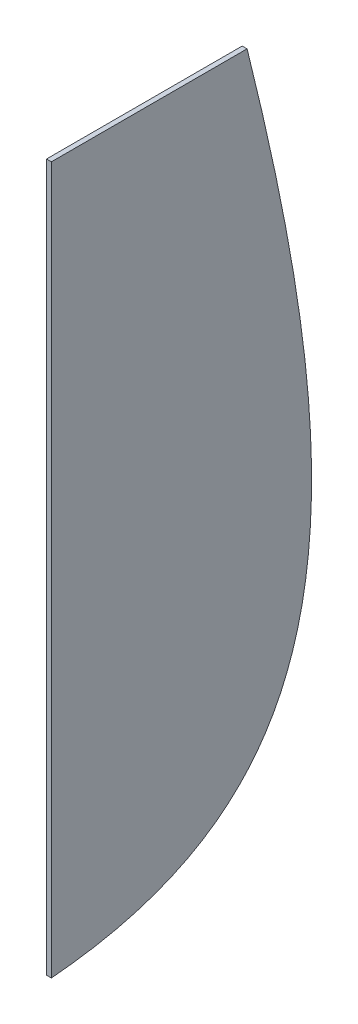
ISO-10303-21;
HEADER;
FILE_DESCRIPTION(('STEP AP214'),'2;1');
FILE_NAME('part.step','',(''),(''),'','','');
FILE_SCHEMA(('AUTOMOTIVE_DESIGN { 1 0 10303 214 1 1 1 1 }'));
ENDSEC;
DATA;
#1=APPLICATION_CONTEXT('core data for automotive mechanical design processes');
#2=APPLICATION_PROTOCOL_DEFINITION('international standard','automotive_design',2000,#1);
#3=PRODUCT_CONTEXT('',#1,'mechanical');
#4=PRODUCT('Part','Part','',(#3));
#5=PRODUCT_RELATED_PRODUCT_CATEGORY('part','',(#4));
#6=PRODUCT_DEFINITION_FORMATION('','',#4);
#7=PRODUCT_DEFINITION_CONTEXT('part definition',#1,'design');
#8=PRODUCT_DEFINITION('design','',#6,#7);
#9=PRODUCT_DEFINITION_SHAPE('','',#8);
#10=(LENGTH_UNIT() NAMED_UNIT(*) SI_UNIT(.MILLI.,.METRE.));
#11=(NAMED_UNIT(*) PLANE_ANGLE_UNIT() SI_UNIT($,.RADIAN.));
#12=(NAMED_UNIT(*) SI_UNIT($,.STERADIAN.) SOLID_ANGLE_UNIT());
#13=UNCERTAINTY_MEASURE_WITH_UNIT(LENGTH_MEASURE(1.E-05),#10,'distance_accuracy_value','');
#14=(GEOMETRIC_REPRESENTATION_CONTEXT(3) GLOBAL_UNCERTAINTY_ASSIGNED_CONTEXT((#13)) GLOBAL_UNIT_ASSIGNED_CONTEXT((#10,
#11,#12)) REPRESENTATION_CONTEXT('',''));
#15=CARTESIAN_POINT('',(0.,0.,0.));
#16=DIRECTION('',(0.,0.,1.));
#17=DIRECTION('',(1.,0.,0.));
#18=AXIS2_PLACEMENT_3D('',#15,#16,#17);
#19=CARTESIAN_POINT('',(-0.50000000000014,-1.5206108960727E-13,-40.1439662287613));
#20=DIRECTION('',(0.,-1.,0.));
#21=DIRECTION('',(0.,0.,1.));
#22=AXIS2_PLACEMENT_3D('',#19,#20,#21);
#23=PLANE('',#22);
#24=DIRECTION('',(0.,0.,-1.));
#25=VECTOR('',#24,1.);
#26=CARTESIAN_POINT('',(0.49999999999986,-1.38095164251897E-13,-40.1439662287613));
#27=LINE('',#26,#25);
#28=CARTESIAN_POINT('',(0.5,0.,0.));
#29=VERTEX_POINT('',#28);
#30=CARTESIAN_POINT('',(0.49999999999986,-1.38095164251897E-13,-40.1439662287613));
#31=VERTEX_POINT('',#30);
#32=EDGE_CURVE('E66',#29,#31,#27,.T.);
#33=ORIENTED_EDGE('',*,*,#32,.T.);
#34=DIRECTION('',(1.,0.,0.));
#35=VECTOR('',#34,1.);
#36=CARTESIAN_POINT('',(-0.50000000000014,-1.5206108960727E-13,-40.1439662287613));
#37=LINE('',#36,#35);
#38=CARTESIAN_POINT('',(-0.50000000000014,-1.5206108960727E-13,-40.1439662287613));
#39=VERTEX_POINT('',#38);
#40=EDGE_CURVE('E44',#39,#31,#37,.T.);
#41=ORIENTED_EDGE('',*,*,#40,.F.);
#42=DIRECTION('',(0.,0.,-1.));
#43=VECTOR('',#42,1.);
#44=CARTESIAN_POINT('',(-0.50000000000014,-1.5206108960727E-13,-40.1439662287613));
#45=LINE('',#44,#43);
#46=CARTESIAN_POINT('',(-0.5,0.,0.));
#47=VERTEX_POINT('',#46);
#48=EDGE_CURVE('E74',#47,#39,#45,.T.);
#49=ORIENTED_EDGE('',*,*,#48,.F.);
#50=DIRECTION('',(1.,0.,0.));
#51=VECTOR('',#50,1.);
#52=CARTESIAN_POINT('',(-0.5,0.,0.));
#53=LINE('',#52,#51);
#54=EDGE_CURVE('E11',#47,#29,#53,.T.);
#55=ORIENTED_EDGE('',*,*,#54,.T.);
#56=EDGE_LOOP('',(#33,#41,#49,#55));
#57=FACE_BOUND('',#56,.T.);
#58=ADVANCED_FACE('F36',(#57),#23,.F.);
#59=CARTESIAN_POINT('',(-0.50000000000014,-1.5206108960727E-13,-40.1439662287613));
#60=CARTESIAN_POINT('',(-0.499999999998881,-96.1055639621332,-64.0701194417086));
#61=CARTESIAN_POINT('',(-0.499999999998248,-140.053769681774,-58.2824836294395));
#62=CARTESIAN_POINT('',(-0.499999999997975,-145.,5.08010534801672E-13));
#63=B_SPLINE_CURVE_WITH_KNOTS('',3,(#59,#60,#61,#62),.UNSPECIFIED.,.F.,.F.,(4,4),(0.,1.),.UNSPECIFIED.);
#64=DIRECTION('',(1.,0.,0.));
#65=VECTOR('',#64,1.);
#66=SURFACE_OF_LINEAR_EXTRUSION('',#63,#65);
#67=CARTESIAN_POINT('',(0.49999999999986,-1.38095164251897E-13,-40.1439662287613));
#68=CARTESIAN_POINT('',(0.500000000001119,-96.1055639621332,-64.0701194417086));
#69=CARTESIAN_POINT('',(0.500000000001752,-140.053769681774,-58.2824836294395));
#70=CARTESIAN_POINT('',(0.500000000002025,-145.,5.04519053462829E-13));
#71=B_SPLINE_CURVE_WITH_KNOTS('',3,(#67,#68,#69,#70),.UNSPECIFIED.,.F.,.F.,(4,4),(0.,1.),.UNSPECIFIED.);
#72=CARTESIAN_POINT('',(0.500000000002025,-145.,5.04519053462829E-13));
#73=VERTEX_POINT('',#72);
#74=EDGE_CURVE('E72',#31,#73,#71,.T.);
#75=ORIENTED_EDGE('',*,*,#74,.T.);
#76=DIRECTION('',(1.,0.,0.));
#77=VECTOR('',#76,1.);
#78=CARTESIAN_POINT('',(-0.499999999997975,-145.,5.08010534801672E-13));
#79=LINE('',#78,#77);
#80=CARTESIAN_POINT('',(-0.499999999997975,-145.,5.08010534801672E-13));
#81=VERTEX_POINT('',#80);
#82=EDGE_CURVE('E84',#81,#73,#79,.T.);
#83=ORIENTED_EDGE('',*,*,#82,.F.);
#84=EDGE_CURVE('E77',#39,#81,#63,.T.);
#85=ORIENTED_EDGE('',*,*,#84,.F.);
#86=ORIENTED_EDGE('',*,*,#40,.T.);
#87=EDGE_LOOP('',(#75,#83,#85,#86));
#88=FACE_BOUND('',#87,.T.);
#89=ADVANCED_FACE('F100',(#88),#66,.F.);
#90=CARTESIAN_POINT('',(-0.499999999999791,-15.,0.));
#91=DIRECTION('',(0.,0.,-1.));
#92=DIRECTION('',(0.,-1.,0.));
#93=AXIS2_PLACEMENT_3D('',#90,#91,#92);
#94=PLANE('',#93);
#95=DIRECTION('',(0.,1.,0.));
#96=VECTOR('',#95,1.);
#97=CARTESIAN_POINT('',(0.500000000000209,-15.,0.));
#98=LINE('',#97,#96);
#99=EDGE_CURVE('E80',#73,#29,#98,.T.);
#100=ORIENTED_EDGE('',*,*,#99,.T.);
#101=ORIENTED_EDGE('',*,*,#54,.F.);
#102=DIRECTION('',(0.,1.,0.));
#103=VECTOR('',#102,1.);
#104=CARTESIAN_POINT('',(-0.5,0.,0.));
#105=LINE('',#104,#103);
#106=EDGE_CURVE('E52',#81,#47,#105,.T.);
#107=ORIENTED_EDGE('',*,*,#106,.F.);
#108=ORIENTED_EDGE('',*,*,#82,.T.);
#109=EDGE_LOOP('',(#100,#101,#107,#108));
#110=FACE_BOUND('',#109,.T.);
#111=ADVANCED_FACE('F82',(#110),#94,.F.);
#112=CARTESIAN_POINT('',(-0.499999999998688,-106.684750116465,-50.9002219302756));
#113=DIRECTION('',(1.,0.,0.));
#114=DIRECTION('',(0.,1.,0.));
#115=AXIS2_PLACEMENT_3D('',#112,#113,#114);
#116=PLANE('',#115);
#117=ORIENTED_EDGE('',*,*,#106,.T.);
#118=ORIENTED_EDGE('',*,*,#48,.T.);
#119=ORIENTED_EDGE('',*,*,#84,.T.);
#120=EDGE_LOOP('',(#117,#118,#119));
#121=FACE_BOUND('',#120,.T.);
#122=ADVANCED_FACE('F79',(#121),#116,.F.);
#123=CARTESIAN_POINT('',(0.500000000001312,-106.684750116465,-50.9002219302756));
#124=DIRECTION('',(1.,0.,0.));
#125=DIRECTION('',(0.,1.,0.));
#126=AXIS2_PLACEMENT_3D('',#123,#124,#125);
#127=PLANE('',#126);
#128=ORIENTED_EDGE('',*,*,#32,.F.);
#129=ORIENTED_EDGE('',*,*,#99,.F.);
#130=ORIENTED_EDGE('',*,*,#74,.F.);
#131=EDGE_LOOP('',(#128,#129,#130));
#132=FACE_BOUND('',#131,.T.);
#133=ADVANCED_FACE('F87',(#132),#127,.T.);
#134=CLOSED_SHELL('',(#58,#89,#111,#122,#133));
#135=MANIFOLD_SOLID_BREP('B2',#134);
#136=ADVANCED_BREP_SHAPE_REPRESENTATION('',(#18,#135),#14);
#137=SHAPE_DEFINITION_REPRESENTATION(#9,#136);
ENDSEC;
END-ISO-10303-21;
